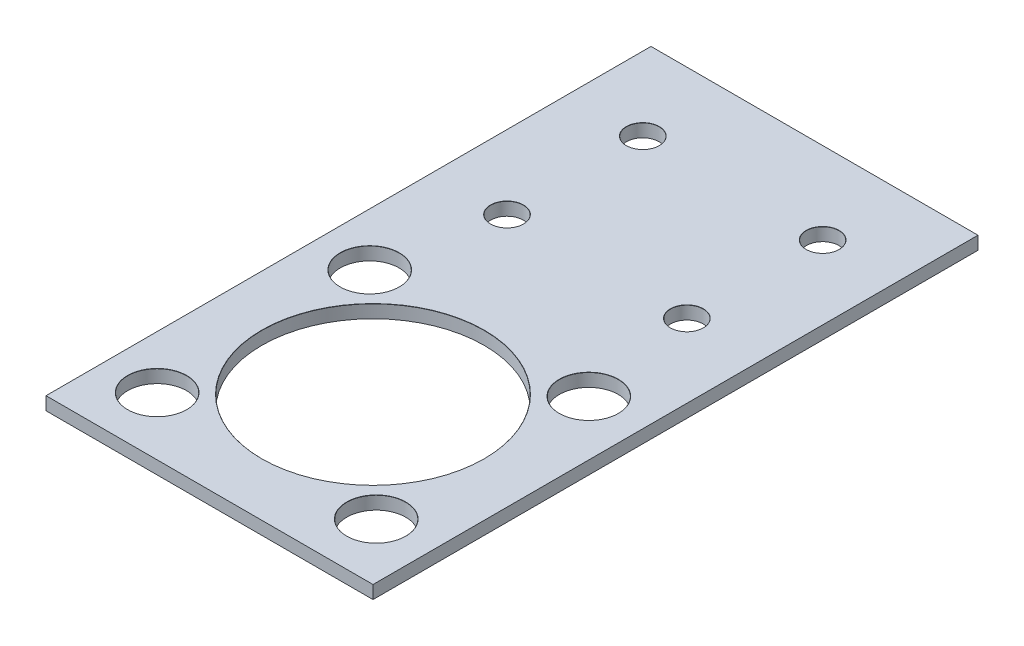
ISO-10303-21;
HEADER;
FILE_DESCRIPTION(('STEP AP214'),'2;1');
FILE_NAME('part.step','',(''),(''),'','','');
FILE_SCHEMA(('AUTOMOTIVE_DESIGN { 1 0 10303 214 1 1 1 1 }'));
ENDSEC;
DATA;
#1=APPLICATION_CONTEXT('core data for automotive mechanical design processes');
#2=APPLICATION_PROTOCOL_DEFINITION('international standard','automotive_design',2000,#1);
#3=PRODUCT_CONTEXT('',#1,'mechanical');
#4=PRODUCT('Part','Part','',(#3));
#5=PRODUCT_RELATED_PRODUCT_CATEGORY('part','',(#4));
#6=PRODUCT_DEFINITION_FORMATION('','',#4);
#7=PRODUCT_DEFINITION_CONTEXT('part definition',#1,'design');
#8=PRODUCT_DEFINITION('design','',#6,#7);
#9=PRODUCT_DEFINITION_SHAPE('','',#8);
#10=(LENGTH_UNIT() NAMED_UNIT(*) SI_UNIT(.MILLI.,.METRE.));
#11=(NAMED_UNIT(*) PLANE_ANGLE_UNIT() SI_UNIT($,.RADIAN.));
#12=(NAMED_UNIT(*) SI_UNIT($,.STERADIAN.) SOLID_ANGLE_UNIT());
#13=UNCERTAINTY_MEASURE_WITH_UNIT(LENGTH_MEASURE(1.E-05),#10,'distance_accuracy_value','');
#14=(GEOMETRIC_REPRESENTATION_CONTEXT(3) GLOBAL_UNCERTAINTY_ASSIGNED_CONTEXT((#13)) GLOBAL_UNIT_ASSIGNED_CONTEXT((#10,
#11,#12)) REPRESENTATION_CONTEXT('',''));
#15=CARTESIAN_POINT('',(0.,0.,0.));
#16=DIRECTION('',(0.,0.,1.));
#17=DIRECTION('',(1.,0.,0.));
#18=AXIS2_PLACEMENT_3D('',#15,#16,#17);
#19=CARTESIAN_POINT('',(-27.5,-2.,-45.));
#20=DIRECTION('',(-1.,0.,0.));
#21=DIRECTION('',(0.,0.,1.));
#22=AXIS2_PLACEMENT_3D('',#19,#20,#21);
#23=PLANE('',#22);
#24=DIRECTION('',(0.,0.,1.));
#25=VECTOR('',#24,1.);
#26=CARTESIAN_POINT('',(-27.5,0.,-45.));
#27=LINE('',#26,#25);
#28=CARTESIAN_POINT('',(-27.5,0.,-45.));
#29=VERTEX_POINT('',#28);
#30=CARTESIAN_POINT('',(-27.5,0.,47.5));
#31=VERTEX_POINT('',#30);
#32=EDGE_CURVE('E110',#29,#31,#27,.T.);
#33=ORIENTED_EDGE('',*,*,#32,.F.);
#34=DIRECTION('',(0.,1.,0.));
#35=VECTOR('',#34,1.);
#36=CARTESIAN_POINT('',(-27.5,-2.,-45.));
#37=LINE('',#36,#35);
#38=CARTESIAN_POINT('',(-27.5,-2.,-45.));
#39=VERTEX_POINT('',#38);
#40=EDGE_CURVE('E11',#39,#29,#37,.T.);
#41=ORIENTED_EDGE('',*,*,#40,.F.);
#42=DIRECTION('',(0.,0.,1.));
#43=VECTOR('',#42,1.);
#44=CARTESIAN_POINT('',(-27.5,-2.,-45.));
#45=LINE('',#44,#43);
#46=CARTESIAN_POINT('',(-27.5,-2.,47.5));
#47=VERTEX_POINT('',#46);
#48=EDGE_CURVE('E103',#39,#47,#45,.T.);
#49=ORIENTED_EDGE('',*,*,#48,.T.);
#50=DIRECTION('',(0.,1.,0.));
#51=VECTOR('',#50,1.);
#52=CARTESIAN_POINT('',(-27.5,-2.,47.5));
#53=LINE('',#52,#51);
#54=EDGE_CURVE('E48',#47,#31,#53,.T.);
#55=ORIENTED_EDGE('',*,*,#54,.T.);
#56=EDGE_LOOP('',(#33,#41,#49,#55));
#57=FACE_BOUND('',#56,.T.);
#58=ADVANCED_FACE('F45',(#57),#23,.T.);
#59=CARTESIAN_POINT('',(-27.5,-2.,-45.));
#60=DIRECTION('',(0.,0.,-1.));
#61=DIRECTION('',(-1.,0.,0.));
#62=AXIS2_PLACEMENT_3D('',#59,#60,#61);
#63=PLANE('',#62);
#64=DIRECTION('',(-1.,0.,0.));
#65=VECTOR('',#64,1.);
#66=CARTESIAN_POINT('',(-27.5,0.,-45.));
#67=LINE('',#66,#65);
#68=CARTESIAN_POINT('',(22.5,0.,-45.));
#69=VERTEX_POINT('',#68);
#70=EDGE_CURVE('E105',#69,#29,#67,.T.);
#71=ORIENTED_EDGE('',*,*,#70,.F.);
#72=DIRECTION('',(0.,1.,0.));
#73=VECTOR('',#72,1.);
#74=CARTESIAN_POINT('',(22.5,-2.,-45.));
#75=LINE('',#74,#73);
#76=CARTESIAN_POINT('',(22.5,-2.,-45.));
#77=VERTEX_POINT('',#76);
#78=EDGE_CURVE('E54',#77,#69,#75,.T.);
#79=ORIENTED_EDGE('',*,*,#78,.F.);
#80=DIRECTION('',(-1.,0.,0.));
#81=VECTOR('',#80,1.);
#82=CARTESIAN_POINT('',(-27.5,-2.,-45.));
#83=LINE('',#82,#81);
#84=EDGE_CURVE('E100',#77,#39,#83,.T.);
#85=ORIENTED_EDGE('',*,*,#84,.T.);
#86=ORIENTED_EDGE('',*,*,#40,.T.);
#87=EDGE_LOOP('',(#71,#79,#85,#86));
#88=FACE_BOUND('',#87,.T.);
#89=ADVANCED_FACE('F121',(#88),#63,.T.);
#90=CARTESIAN_POINT('',(22.5,-2.,-45.));
#91=DIRECTION('',(1.,0.,0.));
#92=DIRECTION('',(0.,0.,-1.));
#93=AXIS2_PLACEMENT_3D('',#90,#91,#92);
#94=PLANE('',#93);
#95=DIRECTION('',(0.,0.,-1.));
#96=VECTOR('',#95,1.);
#97=CARTESIAN_POINT('',(22.5,0.,-45.));
#98=LINE('',#97,#96);
#99=CARTESIAN_POINT('',(22.5,0.,47.5));
#100=VERTEX_POINT('',#99);
#101=EDGE_CURVE('E95',#100,#69,#98,.T.);
#102=ORIENTED_EDGE('',*,*,#101,.F.);
#103=DIRECTION('',(0.,1.,0.));
#104=VECTOR('',#103,1.);
#105=CARTESIAN_POINT('',(22.5,-2.,47.5));
#106=LINE('',#105,#104);
#107=CARTESIAN_POINT('',(22.5,-2.,47.5));
#108=VERTEX_POINT('',#107);
#109=EDGE_CURVE('E90',#108,#100,#106,.T.);
#110=ORIENTED_EDGE('',*,*,#109,.F.);
#111=DIRECTION('',(0.,0.,-1.));
#112=VECTOR('',#111,1.);
#113=CARTESIAN_POINT('',(22.5,-2.,-45.));
#114=LINE('',#113,#112);
#115=EDGE_CURVE('E93',#108,#77,#114,.T.);
#116=ORIENTED_EDGE('',*,*,#115,.T.);
#117=ORIENTED_EDGE('',*,*,#78,.T.);
#118=EDGE_LOOP('',(#102,#110,#116,#117));
#119=FACE_BOUND('',#118,.T.);
#120=ADVANCED_FACE('F92',(#119),#94,.T.);
#121=CARTESIAN_POINT('',(-27.5,-2.,47.5));
#122=DIRECTION('',(0.,0.,1.));
#123=DIRECTION('',(1.,0.,0.));
#124=AXIS2_PLACEMENT_3D('',#121,#122,#123);
#125=PLANE('',#124);
#126=DIRECTION('',(1.,0.,0.));
#127=VECTOR('',#126,1.);
#128=CARTESIAN_POINT('',(-27.5,0.,47.5));
#129=LINE('',#128,#127);
#130=EDGE_CURVE('E113',#31,#100,#129,.T.);
#131=ORIENTED_EDGE('',*,*,#130,.F.);
#132=ORIENTED_EDGE('',*,*,#54,.F.);
#133=DIRECTION('',(1.,0.,0.));
#134=VECTOR('',#133,1.);
#135=CARTESIAN_POINT('',(-27.5,-2.,47.5));
#136=LINE('',#135,#134);
#137=EDGE_CURVE('E99',#47,#108,#136,.T.);
#138=ORIENTED_EDGE('',*,*,#137,.T.);
#139=ORIENTED_EDGE('',*,*,#109,.T.);
#140=EDGE_LOOP('',(#131,#132,#138,#139));
#141=FACE_BOUND('',#140,.T.);
#142=ADVANCED_FACE('F102',(#141),#125,.T.);
#143=CARTESIAN_POINT('',(0.,-2.,0.));
#144=DIRECTION('',(0.,1.,0.));
#145=DIRECTION('',(0.,0.,1.));
#146=AXIS2_PLACEMENT_3D('',#143,#144,#145);
#147=PLANE('',#146);
#148=CARTESIAN_POINT('',(-2.66707016409417,-2.,22.3372872336951));
#149=DIRECTION('',(0.,1.,0.));
#150=DIRECTION('',(0.,0.,1.));
#151=AXIS2_PLACEMENT_3D('',#148,#149,#150);
#152=CIRCLE('',#151,17.);
#153=CARTESIAN_POINT('',(-2.66707016409417,-2.,39.3372872336951));
#154=VERTEX_POINT('',#153);
#155=EDGE_CURVE('E224',#154,#154,#152,.T.);
#156=ORIENTED_EDGE('',*,*,#155,.T.);
#157=EDGE_LOOP('',(#156));
#158=FACE_BOUND('',#157,.T.);
#159=CARTESIAN_POINT('',(-19.4170701640942,-2.,38.5872872336951));
#160=DIRECTION('',(0.,1.,0.));
#161=DIRECTION('',(0.,0.,1.));
#162=AXIS2_PLACEMENT_3D('',#159,#160,#161);
#163=CIRCLE('',#162,4.5);
#164=CARTESIAN_POINT('',(-19.4170701640942,-2.,43.0872872336951));
#165=VERTEX_POINT('',#164);
#166=EDGE_CURVE('E234',#165,#165,#163,.T.);
#167=ORIENTED_EDGE('',*,*,#166,.T.);
#168=EDGE_LOOP('',(#167));
#169=FACE_BOUND('',#168,.T.);
#170=CARTESIAN_POINT('',(14.0829298359058,-2.,38.5872872336951));
#171=DIRECTION('',(0.,1.,0.));
#172=DIRECTION('',(0.,0.,1.));
#173=AXIS2_PLACEMENT_3D('',#170,#171,#172);
#174=CIRCLE('',#173,4.5);
#175=CARTESIAN_POINT('',(14.0829298359058,-2.,43.0872872336951));
#176=VERTEX_POINT('',#175);
#177=EDGE_CURVE('E243',#176,#176,#174,.T.);
#178=ORIENTED_EDGE('',*,*,#177,.T.);
#179=EDGE_LOOP('',(#178));
#180=FACE_BOUND('',#179,.T.);
#181=CARTESIAN_POINT('',(14.0829298359058,-2.,6.08728723369514));
#182=DIRECTION('',(0.,1.,0.));
#183=DIRECTION('',(0.,0.,1.));
#184=AXIS2_PLACEMENT_3D('',#181,#182,#183);
#185=CIRCLE('',#184,4.5);
#186=CARTESIAN_POINT('',(14.0829298359058,-2.,10.5872872336951));
#187=VERTEX_POINT('',#186);
#188=EDGE_CURVE('E252',#187,#187,#185,.T.);
#189=ORIENTED_EDGE('',*,*,#188,.T.);
#190=EDGE_LOOP('',(#189));
#191=FACE_BOUND('',#190,.T.);
#192=CARTESIAN_POINT('',(-19.4170701640942,-2.,6.08728723369514));
#193=DIRECTION('',(0.,1.,0.));
#194=DIRECTION('',(0.,0.,1.));
#195=AXIS2_PLACEMENT_3D('',#192,#193,#194);
#196=CIRCLE('',#195,4.5);
#197=CARTESIAN_POINT('',(-19.4170701640942,-2.,10.5872872336951));
#198=VERTEX_POINT('',#197);
#199=EDGE_CURVE('E261',#198,#198,#196,.T.);
#200=ORIENTED_EDGE('',*,*,#199,.T.);
#201=EDGE_LOOP('',(#200));
#202=FACE_BOUND('',#201,.T.);
#203=CARTESIAN_POINT('',(-16.25,-2.,-32.5));
#204=DIRECTION('',(0.,1.,0.));
#205=DIRECTION('',(0.,0.,1.));
#206=AXIS2_PLACEMENT_3D('',#203,#204,#205);
#207=CIRCLE('',#206,2.49999999999999);
#208=CARTESIAN_POINT('',(-16.25,-2.,-30.));
#209=VERTEX_POINT('',#208);
#210=EDGE_CURVE('E270',#209,#209,#207,.T.);
#211=ORIENTED_EDGE('',*,*,#210,.T.);
#212=EDGE_LOOP('',(#211));
#213=FACE_BOUND('',#212,.T.);
#214=CARTESIAN_POINT('',(-16.25,-2.,-11.74));
#215=DIRECTION('',(0.,1.,0.));
#216=DIRECTION('',(0.,0.,1.));
#217=AXIS2_PLACEMENT_3D('',#214,#215,#216);
#218=CIRCLE('',#217,2.49999999999999);
#219=CARTESIAN_POINT('',(-16.25,-2.,-9.24));
#220=VERTEX_POINT('',#219);
#221=EDGE_CURVE('E279',#220,#220,#218,.T.);
#222=ORIENTED_EDGE('',*,*,#221,.T.);
#223=EDGE_LOOP('',(#222));
#224=FACE_BOUND('',#223,.T.);
#225=CARTESIAN_POINT('',(11.25,-2.,-32.5));
#226=DIRECTION('',(0.,1.,0.));
#227=DIRECTION('',(0.,0.,1.));
#228=AXIS2_PLACEMENT_3D('',#225,#226,#227);
#229=CIRCLE('',#228,2.49999999999999);
#230=CARTESIAN_POINT('',(11.25,-2.,-30.));
#231=VERTEX_POINT('',#230);
#232=EDGE_CURVE('E288',#231,#231,#229,.T.);
#233=ORIENTED_EDGE('',*,*,#232,.T.);
#234=EDGE_LOOP('',(#233));
#235=FACE_BOUND('',#234,.T.);
#236=CARTESIAN_POINT('',(11.25,-2.,-11.74));
#237=DIRECTION('',(0.,1.,0.));
#238=DIRECTION('',(0.,0.,1.));
#239=AXIS2_PLACEMENT_3D('',#236,#237,#238);
#240=CIRCLE('',#239,2.49999999999999);
#241=CARTESIAN_POINT('',(11.25,-2.,-9.23999999999998));
#242=VERTEX_POINT('',#241);
#243=EDGE_CURVE('E114',#242,#242,#240,.T.);
#244=ORIENTED_EDGE('',*,*,#243,.T.);
#245=EDGE_LOOP('',(#244));
#246=FACE_BOUND('',#245,.T.);
#247=ORIENTED_EDGE('',*,*,#48,.F.);
#248=ORIENTED_EDGE('',*,*,#84,.F.);
#249=ORIENTED_EDGE('',*,*,#115,.F.);
#250=ORIENTED_EDGE('',*,*,#137,.F.);
#251=EDGE_LOOP('',(#247,#248,#249,#250));
#252=FACE_BOUND('',#251,.T.);
#253=ADVANCED_FACE('F98',(#158,#169,#180,#191,#202,#213,#224,#235,#246,#252),#147,.F.);
#254=CARTESIAN_POINT('',(0.,0.,0.));
#255=DIRECTION('',(0.,1.,0.));
#256=DIRECTION('',(0.,0.,1.));
#257=AXIS2_PLACEMENT_3D('',#254,#255,#256);
#258=PLANE('',#257);
#259=CARTESIAN_POINT('',(-2.66707016409417,0.,22.3372872336951));
#260=DIRECTION('',(0.,1.,0.));
#261=DIRECTION('',(0.,0.,1.));
#262=AXIS2_PLACEMENT_3D('',#259,#260,#261);
#263=CIRCLE('',#262,17.025);
#264=CARTESIAN_POINT('',(-2.66707016409417,0.,39.3622872336951));
#265=VERTEX_POINT('',#264);
#266=EDGE_CURVE('E222',#265,#265,#263,.T.);
#267=ORIENTED_EDGE('',*,*,#266,.F.);
#268=EDGE_LOOP('',(#267));
#269=FACE_BOUND('',#268,.T.);
#270=CARTESIAN_POINT('',(-19.4170701640942,0.,38.5872872336951));
#271=DIRECTION('',(0.,1.,0.));
#272=DIRECTION('',(0.,0.,1.));
#273=AXIS2_PLACEMENT_3D('',#270,#271,#272);
#274=CIRCLE('',#273,4.525);
#275=CARTESIAN_POINT('',(-19.4170701640942,0.,43.1122872336951));
#276=VERTEX_POINT('',#275);
#277=EDGE_CURVE('E228',#276,#276,#274,.T.);
#278=ORIENTED_EDGE('',*,*,#277,.F.);
#279=EDGE_LOOP('',(#278));
#280=FACE_BOUND('',#279,.T.);
#281=CARTESIAN_POINT('',(14.0829298359058,0.,38.5872872336951));
#282=DIRECTION('',(0.,1.,0.));
#283=DIRECTION('',(0.,0.,1.));
#284=AXIS2_PLACEMENT_3D('',#281,#282,#283);
#285=CIRCLE('',#284,4.525);
#286=CARTESIAN_POINT('',(14.0829298359058,0.,43.1122872336951));
#287=VERTEX_POINT('',#286);
#288=EDGE_CURVE('E237',#287,#287,#285,.T.);
#289=ORIENTED_EDGE('',*,*,#288,.F.);
#290=EDGE_LOOP('',(#289));
#291=FACE_BOUND('',#290,.T.);
#292=CARTESIAN_POINT('',(14.0829298359058,0.,6.08728723369514));
#293=DIRECTION('',(0.,1.,0.));
#294=DIRECTION('',(0.,0.,1.));
#295=AXIS2_PLACEMENT_3D('',#292,#293,#294);
#296=CIRCLE('',#295,4.525);
#297=CARTESIAN_POINT('',(14.0829298359058,0.,10.6122872336951));
#298=VERTEX_POINT('',#297);
#299=EDGE_CURVE('E246',#298,#298,#296,.T.);
#300=ORIENTED_EDGE('',*,*,#299,.F.);
#301=EDGE_LOOP('',(#300));
#302=FACE_BOUND('',#301,.T.);
#303=CARTESIAN_POINT('',(-19.4170701640942,0.,6.08728723369514));
#304=DIRECTION('',(0.,1.,0.));
#305=DIRECTION('',(0.,0.,1.));
#306=AXIS2_PLACEMENT_3D('',#303,#304,#305);
#307=CIRCLE('',#306,4.525);
#308=CARTESIAN_POINT('',(-19.4170701640942,0.,10.6122872336951));
#309=VERTEX_POINT('',#308);
#310=EDGE_CURVE('E255',#309,#309,#307,.T.);
#311=ORIENTED_EDGE('',*,*,#310,.F.);
#312=EDGE_LOOP('',(#311));
#313=FACE_BOUND('',#312,.T.);
#314=CARTESIAN_POINT('',(-16.25,0.,-32.5));
#315=DIRECTION('',(0.,1.,0.));
#316=DIRECTION('',(0.,0.,1.));
#317=AXIS2_PLACEMENT_3D('',#314,#315,#316);
#318=CIRCLE('',#317,2.525);
#319=CARTESIAN_POINT('',(-16.25,0.,-29.975));
#320=VERTEX_POINT('',#319);
#321=EDGE_CURVE('E264',#320,#320,#318,.T.);
#322=ORIENTED_EDGE('',*,*,#321,.F.);
#323=EDGE_LOOP('',(#322));
#324=FACE_BOUND('',#323,.T.);
#325=CARTESIAN_POINT('',(-16.25,0.,-11.74));
#326=DIRECTION('',(0.,1.,0.));
#327=DIRECTION('',(0.,0.,1.));
#328=AXIS2_PLACEMENT_3D('',#325,#326,#327);
#329=CIRCLE('',#328,2.525);
#330=CARTESIAN_POINT('',(-16.25,0.,-9.21499999999999));
#331=VERTEX_POINT('',#330);
#332=EDGE_CURVE('E273',#331,#331,#329,.T.);
#333=ORIENTED_EDGE('',*,*,#332,.F.);
#334=EDGE_LOOP('',(#333));
#335=FACE_BOUND('',#334,.T.);
#336=CARTESIAN_POINT('',(11.25,0.,-32.5));
#337=DIRECTION('',(0.,1.,0.));
#338=DIRECTION('',(0.,0.,1.));
#339=AXIS2_PLACEMENT_3D('',#336,#337,#338);
#340=CIRCLE('',#339,2.525);
#341=CARTESIAN_POINT('',(11.25,0.,-29.975));
#342=VERTEX_POINT('',#341);
#343=EDGE_CURVE('E282',#342,#342,#340,.T.);
#344=ORIENTED_EDGE('',*,*,#343,.F.);
#345=EDGE_LOOP('',(#344));
#346=FACE_BOUND('',#345,.T.);
#347=CARTESIAN_POINT('',(11.25,0.,-11.74));
#348=DIRECTION('',(0.,1.,0.));
#349=DIRECTION('',(0.,0.,1.));
#350=AXIS2_PLACEMENT_3D('',#347,#348,#349);
#351=CIRCLE('',#350,2.525);
#352=CARTESIAN_POINT('',(11.25,0.,-9.21499999999997));
#353=VERTEX_POINT('',#352);
#354=EDGE_CURVE('E291',#353,#353,#351,.T.);
#355=ORIENTED_EDGE('',*,*,#354,.F.);
#356=EDGE_LOOP('',(#355));
#357=FACE_BOUND('',#356,.T.);
#358=ORIENTED_EDGE('',*,*,#32,.T.);
#359=ORIENTED_EDGE('',*,*,#130,.T.);
#360=ORIENTED_EDGE('',*,*,#101,.T.);
#361=ORIENTED_EDGE('',*,*,#70,.T.);
#362=EDGE_LOOP('',(#358,#359,#360,#361));
#363=FACE_BOUND('',#362,.T.);
#364=ADVANCED_FACE('F120',(#269,#280,#291,#302,#313,#324,#335,#346,#357,#363),#258,.T.);
#365=CARTESIAN_POINT('',(11.25,0.,-11.74));
#366=DIRECTION('',(0.,1.,0.));
#367=DIRECTION('',(0.,0.,1.));
#368=AXIS2_PLACEMENT_3D('',#365,#366,#367);
#369=CYLINDRICAL_SURFACE('',#368,2.49999999999999);
#370=ORIENTED_EDGE('',*,*,#243,.F.);
#371=EDGE_LOOP('',(#370));
#372=FACE_BOUND('',#371,.T.);
#373=CARTESIAN_POINT('',(11.25,-0.0250000000000007,-11.74));
#374=DIRECTION('',(0.,1.,0.));
#375=DIRECTION('',(0.,0.,1.));
#376=AXIS2_PLACEMENT_3D('',#373,#374,#375);
#377=CIRCLE('',#376,2.5);
#378=CARTESIAN_POINT('',(11.25,-0.0250000000000007,-9.23999999999996));
#379=VERTEX_POINT('',#378);
#380=EDGE_CURVE('E294',#379,#379,#377,.T.);
#381=ORIENTED_EDGE('',*,*,#380,.T.);
#382=EDGE_LOOP('',(#381));
#383=FACE_BOUND('',#382,.T.);
#384=ADVANCED_FACE('F141',(#372,#383),#369,.F.);
#385=CARTESIAN_POINT('',(11.25,0.,-11.74));
#386=DIRECTION('',(0.,1.,0.));
#387=DIRECTION('',(0.,0.,1.));
#388=AXIS2_PLACEMENT_3D('',#385,#386,#387);
#389=CONICAL_SURFACE('',#388,2.525,0.785398163397414);
#390=ORIENTED_EDGE('',*,*,#380,.F.);
#391=EDGE_LOOP('',(#390));
#392=FACE_BOUND('',#391,.T.);
#393=ORIENTED_EDGE('',*,*,#354,.T.);
#394=EDGE_LOOP('',(#393));
#395=FACE_BOUND('',#394,.T.);
#396=ADVANCED_FACE('F147',(#392,#395),#389,.F.);
#397=CARTESIAN_POINT('',(11.25,0.,-32.5));
#398=DIRECTION('',(0.,1.,0.));
#399=DIRECTION('',(0.,0.,1.));
#400=AXIS2_PLACEMENT_3D('',#397,#398,#399);
#401=CYLINDRICAL_SURFACE('',#400,2.49999999999999);
#402=ORIENTED_EDGE('',*,*,#232,.F.);
#403=EDGE_LOOP('',(#402));
#404=FACE_BOUND('',#403,.T.);
#405=CARTESIAN_POINT('',(11.25,-0.0250000000000007,-32.5));
#406=DIRECTION('',(0.,1.,0.));
#407=DIRECTION('',(0.,0.,1.));
#408=AXIS2_PLACEMENT_3D('',#405,#406,#407);
#409=CIRCLE('',#408,2.5);
#410=CARTESIAN_POINT('',(11.25,-0.0250000000000007,-30.));
#411=VERTEX_POINT('',#410);
#412=EDGE_CURVE('E285',#411,#411,#409,.T.);
#413=ORIENTED_EDGE('',*,*,#412,.T.);
#414=EDGE_LOOP('',(#413));
#415=FACE_BOUND('',#414,.T.);
#416=ADVANCED_FACE('F151',(#404,#415),#401,.F.);
#417=CARTESIAN_POINT('',(11.25,0.,-32.5));
#418=DIRECTION('',(0.,1.,0.));
#419=DIRECTION('',(0.,0.,1.));
#420=AXIS2_PLACEMENT_3D('',#417,#418,#419);
#421=CONICAL_SURFACE('',#420,2.525,0.785398163397414);
#422=ORIENTED_EDGE('',*,*,#412,.F.);
#423=EDGE_LOOP('',(#422));
#424=FACE_BOUND('',#423,.T.);
#425=ORIENTED_EDGE('',*,*,#343,.T.);
#426=EDGE_LOOP('',(#425));
#427=FACE_BOUND('',#426,.T.);
#428=ADVANCED_FACE('F155',(#424,#427),#421,.F.);
#429=CARTESIAN_POINT('',(-16.25,0.,-11.74));
#430=DIRECTION('',(0.,1.,0.));
#431=DIRECTION('',(0.,0.,1.));
#432=AXIS2_PLACEMENT_3D('',#429,#430,#431);
#433=CYLINDRICAL_SURFACE('',#432,2.49999999999999);
#434=ORIENTED_EDGE('',*,*,#221,.F.);
#435=EDGE_LOOP('',(#434));
#436=FACE_BOUND('',#435,.T.);
#437=CARTESIAN_POINT('',(-16.25,-0.0250000000000007,-11.74));
#438=DIRECTION('',(0.,1.,0.));
#439=DIRECTION('',(0.,0.,1.));
#440=AXIS2_PLACEMENT_3D('',#437,#438,#439);
#441=CIRCLE('',#440,2.5);
#442=CARTESIAN_POINT('',(-16.25,-0.0250000000000007,-9.23999999999999));
#443=VERTEX_POINT('',#442);
#444=EDGE_CURVE('E276',#443,#443,#441,.T.);
#445=ORIENTED_EDGE('',*,*,#444,.T.);
#446=EDGE_LOOP('',(#445));
#447=FACE_BOUND('',#446,.T.);
#448=ADVANCED_FACE('F159',(#436,#447),#433,.F.);
#449=CARTESIAN_POINT('',(-16.25,0.,-11.74));
#450=DIRECTION('',(0.,1.,0.));
#451=DIRECTION('',(0.,0.,1.));
#452=AXIS2_PLACEMENT_3D('',#449,#450,#451);
#453=CONICAL_SURFACE('',#452,2.525,0.785398163397414);
#454=ORIENTED_EDGE('',*,*,#444,.F.);
#455=EDGE_LOOP('',(#454));
#456=FACE_BOUND('',#455,.T.);
#457=ORIENTED_EDGE('',*,*,#332,.T.);
#458=EDGE_LOOP('',(#457));
#459=FACE_BOUND('',#458,.T.);
#460=ADVANCED_FACE('F163',(#456,#459),#453,.F.);
#461=CARTESIAN_POINT('',(-16.25,0.,-32.5));
#462=DIRECTION('',(0.,1.,0.));
#463=DIRECTION('',(0.,0.,1.));
#464=AXIS2_PLACEMENT_3D('',#461,#462,#463);
#465=CYLINDRICAL_SURFACE('',#464,2.49999999999999);
#466=ORIENTED_EDGE('',*,*,#210,.F.);
#467=EDGE_LOOP('',(#466));
#468=FACE_BOUND('',#467,.T.);
#469=CARTESIAN_POINT('',(-16.25,-0.0250000000000007,-32.5));
#470=DIRECTION('',(0.,1.,0.));
#471=DIRECTION('',(0.,0.,1.));
#472=AXIS2_PLACEMENT_3D('',#469,#470,#471);
#473=CIRCLE('',#472,2.5);
#474=CARTESIAN_POINT('',(-16.25,-0.0250000000000007,-30.));
#475=VERTEX_POINT('',#474);
#476=EDGE_CURVE('E267',#475,#475,#473,.T.);
#477=ORIENTED_EDGE('',*,*,#476,.T.);
#478=EDGE_LOOP('',(#477));
#479=FACE_BOUND('',#478,.T.);
#480=ADVANCED_FACE('F167',(#468,#479),#465,.F.);
#481=CARTESIAN_POINT('',(-16.25,0.,-32.5));
#482=DIRECTION('',(0.,1.,0.));
#483=DIRECTION('',(0.,0.,1.));
#484=AXIS2_PLACEMENT_3D('',#481,#482,#483);
#485=CONICAL_SURFACE('',#484,2.525,0.785398163397414);
#486=ORIENTED_EDGE('',*,*,#476,.F.);
#487=EDGE_LOOP('',(#486));
#488=FACE_BOUND('',#487,.T.);
#489=ORIENTED_EDGE('',*,*,#321,.T.);
#490=EDGE_LOOP('',(#489));
#491=FACE_BOUND('',#490,.T.);
#492=ADVANCED_FACE('F171',(#488,#491),#485,.F.);
#493=CARTESIAN_POINT('',(-19.4170701640942,0.,6.08728723369514));
#494=DIRECTION('',(0.,1.,0.));
#495=DIRECTION('',(0.,0.,1.));
#496=AXIS2_PLACEMENT_3D('',#493,#494,#495);
#497=CYLINDRICAL_SURFACE('',#496,4.5);
#498=ORIENTED_EDGE('',*,*,#199,.F.);
#499=EDGE_LOOP('',(#498));
#500=FACE_BOUND('',#499,.T.);
#501=CARTESIAN_POINT('',(-19.4170701640942,-0.0249999999999968,6.08728723369514));
#502=DIRECTION('',(0.,1.,0.));
#503=DIRECTION('',(0.,0.,1.));
#504=AXIS2_PLACEMENT_3D('',#501,#502,#503);
#505=CIRCLE('',#504,4.5);
#506=CARTESIAN_POINT('',(-19.4170701640942,-0.0249999999999968,10.5872872336951));
#507=VERTEX_POINT('',#506);
#508=EDGE_CURVE('E258',#507,#507,#505,.T.);
#509=ORIENTED_EDGE('',*,*,#508,.T.);
#510=EDGE_LOOP('',(#509));
#511=FACE_BOUND('',#510,.T.);
#512=ADVANCED_FACE('F175',(#500,#511),#497,.F.);
#513=CARTESIAN_POINT('',(-19.4170701640942,0.,6.08728723369514));
#514=DIRECTION('',(0.,1.,0.));
#515=DIRECTION('',(0.,0.,1.));
#516=AXIS2_PLACEMENT_3D('',#513,#514,#515);
#517=CONICAL_SURFACE('',#516,4.525,0.785398163397526);
#518=ORIENTED_EDGE('',*,*,#508,.F.);
#519=EDGE_LOOP('',(#518));
#520=FACE_BOUND('',#519,.T.);
#521=ORIENTED_EDGE('',*,*,#310,.T.);
#522=EDGE_LOOP('',(#521));
#523=FACE_BOUND('',#522,.T.);
#524=ADVANCED_FACE('F179',(#520,#523),#517,.F.);
#525=CARTESIAN_POINT('',(14.0829298359058,0.,6.08728723369514));
#526=DIRECTION('',(0.,1.,0.));
#527=DIRECTION('',(0.,0.,1.));
#528=AXIS2_PLACEMENT_3D('',#525,#526,#527);
#529=CYLINDRICAL_SURFACE('',#528,4.5);
#530=ORIENTED_EDGE('',*,*,#188,.F.);
#531=EDGE_LOOP('',(#530));
#532=FACE_BOUND('',#531,.T.);
#533=CARTESIAN_POINT('',(14.0829298359058,-0.0249999999999968,6.08728723369514));
#534=DIRECTION('',(0.,1.,0.));
#535=DIRECTION('',(0.,0.,1.));
#536=AXIS2_PLACEMENT_3D('',#533,#534,#535);
#537=CIRCLE('',#536,4.5);
#538=CARTESIAN_POINT('',(14.0829298359058,-0.0249999999999968,10.5872872336951));
#539=VERTEX_POINT('',#538);
#540=EDGE_CURVE('E249',#539,#539,#537,.T.);
#541=ORIENTED_EDGE('',*,*,#540,.T.);
#542=EDGE_LOOP('',(#541));
#543=FACE_BOUND('',#542,.T.);
#544=ADVANCED_FACE('F183',(#532,#543),#529,.F.);
#545=CARTESIAN_POINT('',(14.0829298359058,0.,6.08728723369514));
#546=DIRECTION('',(0.,1.,0.));
#547=DIRECTION('',(0.,0.,1.));
#548=AXIS2_PLACEMENT_3D('',#545,#546,#547);
#549=CONICAL_SURFACE('',#548,4.525,0.785398163397526);
#550=ORIENTED_EDGE('',*,*,#540,.F.);
#551=EDGE_LOOP('',(#550));
#552=FACE_BOUND('',#551,.T.);
#553=ORIENTED_EDGE('',*,*,#299,.T.);
#554=EDGE_LOOP('',(#553));
#555=FACE_BOUND('',#554,.T.);
#556=ADVANCED_FACE('F187',(#552,#555),#549,.F.);
#557=CARTESIAN_POINT('',(14.0829298359058,0.,38.5872872336951));
#558=DIRECTION('',(0.,1.,0.));
#559=DIRECTION('',(0.,0.,1.));
#560=AXIS2_PLACEMENT_3D('',#557,#558,#559);
#561=CYLINDRICAL_SURFACE('',#560,4.5);
#562=ORIENTED_EDGE('',*,*,#177,.F.);
#563=EDGE_LOOP('',(#562));
#564=FACE_BOUND('',#563,.T.);
#565=CARTESIAN_POINT('',(14.0829298359058,-0.0249999999999968,38.5872872336951));
#566=DIRECTION('',(0.,1.,0.));
#567=DIRECTION('',(0.,0.,1.));
#568=AXIS2_PLACEMENT_3D('',#565,#566,#567);
#569=CIRCLE('',#568,4.5);
#570=CARTESIAN_POINT('',(14.0829298359058,-0.0249999999999968,43.0872872336951));
#571=VERTEX_POINT('',#570);
#572=EDGE_CURVE('E240',#571,#571,#569,.T.);
#573=ORIENTED_EDGE('',*,*,#572,.T.);
#574=EDGE_LOOP('',(#573));
#575=FACE_BOUND('',#574,.T.);
#576=ADVANCED_FACE('F191',(#564,#575),#561,.F.);
#577=CARTESIAN_POINT('',(14.0829298359058,0.,38.5872872336951));
#578=DIRECTION('',(0.,1.,0.));
#579=DIRECTION('',(0.,0.,1.));
#580=AXIS2_PLACEMENT_3D('',#577,#578,#579);
#581=CONICAL_SURFACE('',#580,4.525,0.785398163397526);
#582=ORIENTED_EDGE('',*,*,#572,.F.);
#583=EDGE_LOOP('',(#582));
#584=FACE_BOUND('',#583,.T.);
#585=ORIENTED_EDGE('',*,*,#288,.T.);
#586=EDGE_LOOP('',(#585));
#587=FACE_BOUND('',#586,.T.);
#588=ADVANCED_FACE('F195',(#584,#587),#581,.F.);
#589=CARTESIAN_POINT('',(-19.4170701640942,0.,38.5872872336951));
#590=DIRECTION('',(0.,1.,0.));
#591=DIRECTION('',(0.,0.,1.));
#592=AXIS2_PLACEMENT_3D('',#589,#590,#591);
#593=CYLINDRICAL_SURFACE('',#592,4.5);
#594=ORIENTED_EDGE('',*,*,#166,.F.);
#595=EDGE_LOOP('',(#594));
#596=FACE_BOUND('',#595,.T.);
#597=CARTESIAN_POINT('',(-19.4170701640942,-0.0249999999999968,38.5872872336951));
#598=DIRECTION('',(0.,1.,0.));
#599=DIRECTION('',(0.,0.,1.));
#600=AXIS2_PLACEMENT_3D('',#597,#598,#599);
#601=CIRCLE('',#600,4.5);
#602=CARTESIAN_POINT('',(-19.4170701640942,-0.0249999999999968,43.0872872336951));
#603=VERTEX_POINT('',#602);
#604=EDGE_CURVE('E231',#603,#603,#601,.T.);
#605=ORIENTED_EDGE('',*,*,#604,.T.);
#606=EDGE_LOOP('',(#605));
#607=FACE_BOUND('',#606,.T.);
#608=ADVANCED_FACE('F199',(#596,#607),#593,.F.);
#609=CARTESIAN_POINT('',(-19.4170701640942,0.,38.5872872336951));
#610=DIRECTION('',(0.,1.,0.));
#611=DIRECTION('',(0.,0.,1.));
#612=AXIS2_PLACEMENT_3D('',#609,#610,#611);
#613=CONICAL_SURFACE('',#612,4.525,0.785398163397526);
#614=ORIENTED_EDGE('',*,*,#604,.F.);
#615=EDGE_LOOP('',(#614));
#616=FACE_BOUND('',#615,.T.);
#617=ORIENTED_EDGE('',*,*,#277,.T.);
#618=EDGE_LOOP('',(#617));
#619=FACE_BOUND('',#618,.T.);
#620=ADVANCED_FACE('F203',(#616,#619),#613,.F.);
#621=CARTESIAN_POINT('',(-2.66707016409417,0.,22.3372872336951));
#622=DIRECTION('',(0.,1.,0.));
#623=DIRECTION('',(0.,0.,1.));
#624=AXIS2_PLACEMENT_3D('',#621,#622,#623);
#625=CYLINDRICAL_SURFACE('',#624,17.);
#626=ORIENTED_EDGE('',*,*,#155,.F.);
#627=EDGE_LOOP('',(#626));
#628=FACE_BOUND('',#627,.T.);
#629=CARTESIAN_POINT('',(-2.66707016409417,-0.0249999999999925,22.3372872336951));
#630=DIRECTION('',(0.,1.,0.));
#631=DIRECTION('',(0.,0.,1.));
#632=AXIS2_PLACEMENT_3D('',#629,#630,#631);
#633=CIRCLE('',#632,17.);
#634=CARTESIAN_POINT('',(-2.66707016409417,-0.0249999999999925,39.3372872336951));
#635=VERTEX_POINT('',#634);
#636=EDGE_CURVE('E219',#635,#635,#633,.T.);
#637=ORIENTED_EDGE('',*,*,#636,.T.);
#638=EDGE_LOOP('',(#637));
#639=FACE_BOUND('',#638,.T.);
#640=ADVANCED_FACE('F206',(#628,#639),#625,.F.);
#641=CARTESIAN_POINT('',(-2.66707016409417,0.,22.3372872336951));
#642=DIRECTION('',(0.,1.,0.));
#643=DIRECTION('',(0.,0.,1.));
#644=AXIS2_PLACEMENT_3D('',#641,#642,#643);
#645=CONICAL_SURFACE('',#644,17.025,0.785398163397544);
#646=ORIENTED_EDGE('',*,*,#636,.F.);
#647=EDGE_LOOP('',(#646));
#648=FACE_BOUND('',#647,.T.);
#649=ORIENTED_EDGE('',*,*,#266,.T.);
#650=EDGE_LOOP('',(#649));
#651=FACE_BOUND('',#650,.T.);
#652=ADVANCED_FACE('F210',(#648,#651),#645,.F.);
#653=CLOSED_SHELL('',(#58,#89,#120,#142,#253,#364,#384,#396,#416,#428,#448,#460,#480,#492,#512,
#524,#544,#556,#576,#588,#608,#620,#640,#652));
#654=MANIFOLD_SOLID_BREP('B2',#653);
#655=ADVANCED_BREP_SHAPE_REPRESENTATION('',(#18,#654),#14);
#656=SHAPE_DEFINITION_REPRESENTATION(#9,#655);
ENDSEC;
END-ISO-10303-21;
